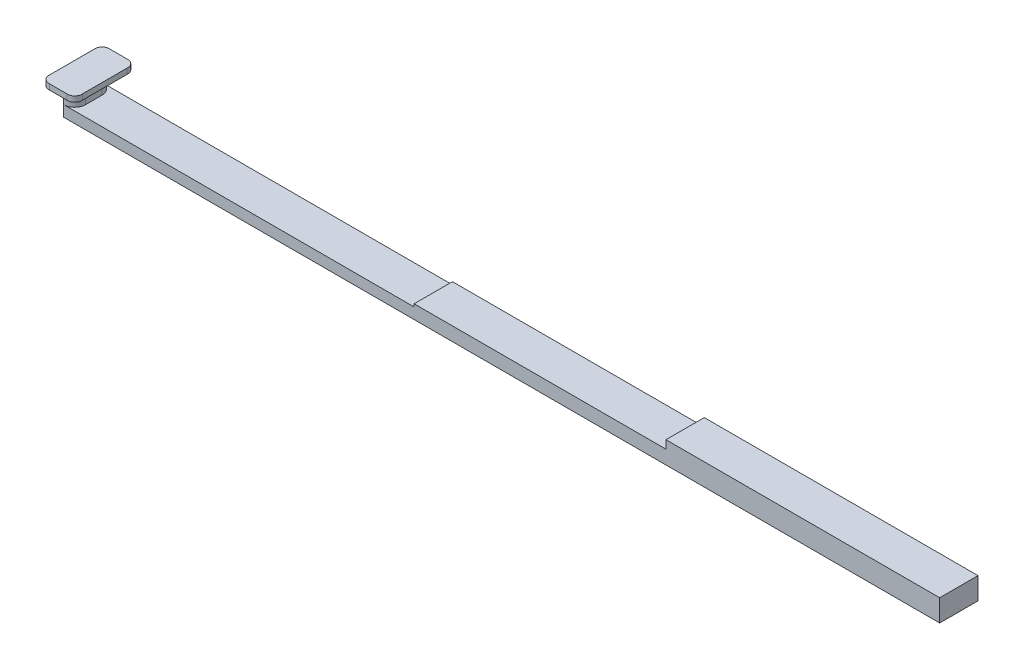
ISO-10303-21;
HEADER;
FILE_DESCRIPTION(('STEP AP214'),'2;1');
FILE_NAME('part.step','',(''),(''),'','','');
FILE_SCHEMA(('AUTOMOTIVE_DESIGN { 1 0 10303 214 1 1 1 1 }'));
ENDSEC;
DATA;
#1=APPLICATION_CONTEXT('core data for automotive mechanical design processes');
#2=APPLICATION_PROTOCOL_DEFINITION('international standard','automotive_design',2000,#1);
#3=PRODUCT_CONTEXT('',#1,'mechanical');
#4=PRODUCT('Part','Part','',(#3));
#5=PRODUCT_RELATED_PRODUCT_CATEGORY('part','',(#4));
#6=PRODUCT_DEFINITION_FORMATION('','',#4);
#7=PRODUCT_DEFINITION_CONTEXT('part definition',#1,'design');
#8=PRODUCT_DEFINITION('design','',#6,#7);
#9=PRODUCT_DEFINITION_SHAPE('','',#8);
#10=(LENGTH_UNIT() NAMED_UNIT(*) SI_UNIT(.MILLI.,.METRE.));
#11=(NAMED_UNIT(*) PLANE_ANGLE_UNIT() SI_UNIT($,.RADIAN.));
#12=(NAMED_UNIT(*) SI_UNIT($,.STERADIAN.) SOLID_ANGLE_UNIT());
#13=UNCERTAINTY_MEASURE_WITH_UNIT(LENGTH_MEASURE(1.E-05),#10,'distance_accuracy_value','');
#14=(GEOMETRIC_REPRESENTATION_CONTEXT(3) GLOBAL_UNCERTAINTY_ASSIGNED_CONTEXT((#13)) GLOBAL_UNIT_ASSIGNED_CONTEXT((#10,
#11,#12)) REPRESENTATION_CONTEXT('',''));
#15=CARTESIAN_POINT('',(0.,0.,0.));
#16=DIRECTION('',(0.,0.,1.));
#17=DIRECTION('',(1.,0.,0.));
#18=AXIS2_PLACEMENT_3D('',#15,#16,#17);
#19=CARTESIAN_POINT('',(0.,1.,0.));
#20=DIRECTION('',(0.,1.,0.));
#21=DIRECTION('',(0.,0.,1.));
#22=AXIS2_PLACEMENT_3D('',#19,#20,#21);
#23=PLANE('',#22);
#24=DIRECTION('',(-1.,0.,0.));
#25=VECTOR('',#24,1.);
#26=CARTESIAN_POINT('',(0.,1.,-3.49999999999999));
#27=LINE('',#26,#25);
#28=CARTESIAN_POINT('',(-23.,1.,-3.49999999999999));
#29=VERTEX_POINT('',#28);
#30=CARTESIAN_POINT('',(-55.,1.,-3.49999999999999));
#31=VERTEX_POINT('',#30);
#32=EDGE_CURVE('E616',#29,#31,#27,.T.);
#33=ORIENTED_EDGE('',*,*,#32,.T.);
#34=CARTESIAN_POINT('',(-55.,1.,-2.49999999999999));
#35=DIRECTION('',(0.,1.,0.));
#36=DIRECTION('',(0.,0.,1.));
#37=AXIS2_PLACEMENT_3D('',#34,#35,#36);
#38=CIRCLE('',#37,1.);
#39=CARTESIAN_POINT('',(-54.,1.,-2.49999999999999));
#40=VERTEX_POINT('',#39);
#41=EDGE_CURVE('E436',#31,#40,#38,.F.);
#42=ORIENTED_EDGE('',*,*,#41,.T.);
#43=DIRECTION('',(0.,0.,-1.));
#44=VECTOR('',#43,1.);
#45=CARTESIAN_POINT('',(-54.,1.,0.));
#46=LINE('',#45,#44);
#47=CARTESIAN_POINT('',(-54.,1.,-0.999999999999993));
#48=VERTEX_POINT('',#47);
#49=EDGE_CURVE('E464',#48,#40,#46,.T.);
#50=ORIENTED_EDGE('',*,*,#49,.F.);
#51=CARTESIAN_POINT('',(-55.,1.,-0.999999999999993));
#52=DIRECTION('',(0.,1.,0.));
#53=DIRECTION('',(0.,0.,1.));
#54=AXIS2_PLACEMENT_3D('',#51,#52,#53);
#55=CIRCLE('',#54,1.);
#56=CARTESIAN_POINT('',(-55.,1.,0.));
#57=VERTEX_POINT('',#56);
#58=EDGE_CURVE('E460',#48,#57,#55,.F.);
#59=ORIENTED_EDGE('',*,*,#58,.T.);
#60=DIRECTION('',(-1.,0.,0.));
#61=VECTOR('',#60,1.);
#62=CARTESIAN_POINT('',(0.,1.,0.));
#63=LINE('',#62,#61);
#64=CARTESIAN_POINT('',(-23.,1.,0.));
#65=VERTEX_POINT('',#64);
#66=EDGE_CURVE('E544',#65,#57,#63,.T.);
#67=ORIENTED_EDGE('',*,*,#66,.F.);
#68=DIRECTION('',(0.,0.,-1.));
#69=VECTOR('',#68,1.);
#70=CARTESIAN_POINT('',(-23.,1.,0.));
#71=LINE('',#70,#69);
#72=EDGE_CURVE('E550',#65,#29,#71,.T.);
#73=ORIENTED_EDGE('',*,*,#72,.T.);
#74=EDGE_LOOP('',(#33,#42,#50,#59,#67,#73));
#75=FACE_BOUND('',#74,.T.);
#76=ADVANCED_FACE('F35',(#75),#23,.T.);
#77=CARTESIAN_POINT('',(-55.,1.,0.));
#78=DIRECTION('',(-1.,0.,0.));
#79=DIRECTION('',(0.,0.,1.));
#80=AXIS2_PLACEMENT_3D('',#77,#78,#79);
#81=PLANE('',#80);
#82=DIRECTION('',(0.,0.,-1.));
#83=VECTOR('',#82,1.);
#84=CARTESIAN_POINT('',(-55.,0.,0.));
#85=LINE('',#84,#83);
#86=CARTESIAN_POINT('',(-55.,0.,0.));
#87=VERTEX_POINT('',#86);
#88=CARTESIAN_POINT('',(-55.,0.,-3.49999999999999));
#89=VERTEX_POINT('',#88);
#90=EDGE_CURVE('E560',#87,#89,#85,.T.);
#91=ORIENTED_EDGE('',*,*,#90,.F.);
#92=DIRECTION('',(0.,-1.,0.));
#93=VECTOR('',#92,1.);
#94=CARTESIAN_POINT('',(-55.,1.,0.));
#95=LINE('',#94,#93);
#96=EDGE_CURVE('E546',#57,#87,#95,.T.);
#97=ORIENTED_EDGE('',*,*,#96,.F.);
#98=CARTESIAN_POINT('',(-55.,1.6894686909815,0.));
#99=VERTEX_POINT('',#98);
#100=EDGE_CURVE('E60',#99,#57,#95,.T.);
#101=ORIENTED_EDGE('',*,*,#100,.F.);
#102=CARTESIAN_POINT('',(-55.,2.91421356237309,0.));
#103=DIRECTION('',(-1.,0.,0.));
#104=DIRECTION('',(0.,-0.707106781186546,-0.707106781186549));
#105=AXIS2_PLACEMENT_3D('',#102,#103,#104);
#106=ELLIPSE('',#105,1.73205080756887,1.);
#107=CARTESIAN_POINT('',(-55.,1.5,-0.707106781186538));
#108=VERTEX_POINT('',#107);
#109=EDGE_CURVE('E402',#99,#108,#106,.F.);
#110=ORIENTED_EDGE('',*,*,#109,.T.);
#111=DIRECTION('',(0.,0.,1.));
#112=VECTOR('',#111,1.);
#113=CARTESIAN_POINT('',(-55.,1.5,0.));
#114=LINE('',#113,#112);
#115=CARTESIAN_POINT('',(-55.,1.5,-2.79289321881345));
#116=VERTEX_POINT('',#115);
#117=EDGE_CURVE('E412',#116,#108,#114,.T.);
#118=ORIENTED_EDGE('',*,*,#117,.F.);
#119=CARTESIAN_POINT('',(-55.,2.91421356237309,-3.49999999999999));
#120=DIRECTION('',(-1.,0.,0.));
#121=DIRECTION('',(0.,-0.707106781186546,0.707106781186549));
#122=AXIS2_PLACEMENT_3D('',#119,#120,#121);
#123=ELLIPSE('',#122,1.73205080756887,1.);
#124=CARTESIAN_POINT('',(-55.,1.6894686909815,-3.49999999999999));
#125=VERTEX_POINT('',#124);
#126=EDGE_CURVE('E45',#116,#125,#123,.F.);
#127=ORIENTED_EDGE('',*,*,#126,.T.);
#128=DIRECTION('',(0.,-1.,0.));
#129=VECTOR('',#128,1.);
#130=CARTESIAN_POINT('',(-55.,1.,-3.49999999999999));
#131=LINE('',#130,#129);
#132=EDGE_CURVE('E52',#125,#31,#131,.T.);
#133=ORIENTED_EDGE('',*,*,#132,.T.);
#134=EDGE_CURVE('E618',#31,#89,#131,.T.);
#135=ORIENTED_EDGE('',*,*,#134,.T.);
#136=EDGE_LOOP('',(#91,#97,#101,#110,#118,#127,#133,#135));
#137=FACE_BOUND('',#136,.T.);
#138=ADVANCED_FACE('F411',(#137),#81,.T.);
#139=CARTESIAN_POINT('',(0.,1.,0.));
#140=DIRECTION('',(0.,0.,1.));
#141=DIRECTION('',(1.,0.,0.));
#142=AXIS2_PLACEMENT_3D('',#139,#140,#141);
#143=PLANE('',#142);
#144=ORIENTED_EDGE('',*,*,#66,.T.);
#145=ORIENTED_EDGE('',*,*,#96,.T.);
#146=DIRECTION('',(-1.,0.,0.));
#147=VECTOR('',#146,1.);
#148=CARTESIAN_POINT('',(0.,0.,0.));
#149=LINE('',#148,#147);
#150=CARTESIAN_POINT('',(25.,0.,0.));
#151=VERTEX_POINT('',#150);
#152=EDGE_CURVE('E620',#151,#87,#149,.T.);
#153=ORIENTED_EDGE('',*,*,#152,.F.);
#154=DIRECTION('',(0.,-1.,0.));
#155=VECTOR('',#154,1.);
#156=CARTESIAN_POINT('',(25.,2.,0.));
#157=LINE('',#156,#155);
#158=CARTESIAN_POINT('',(25.,2.,0.));
#159=VERTEX_POINT('',#158);
#160=EDGE_CURVE('E599',#159,#151,#157,.T.);
#161=ORIENTED_EDGE('',*,*,#160,.F.);
#162=DIRECTION('',(1.,0.,0.));
#163=VECTOR('',#162,1.);
#164=CARTESIAN_POINT('',(0.,2.,0.));
#165=LINE('',#164,#163);
#166=CARTESIAN_POINT('',(0.,2.,0.));
#167=VERTEX_POINT('',#166);
#168=EDGE_CURVE('E575',#167,#159,#165,.T.);
#169=ORIENTED_EDGE('',*,*,#168,.F.);
#170=DIRECTION('',(0.,-1.,0.));
#171=VECTOR('',#170,1.);
#172=CARTESIAN_POINT('',(0.,2.,0.));
#173=LINE('',#172,#171);
#174=CARTESIAN_POINT('',(0.,1.25,0.));
#175=VERTEX_POINT('',#174);
#176=EDGE_CURVE('E590',#167,#175,#173,.T.);
#177=ORIENTED_EDGE('',*,*,#176,.T.);
#178=DIRECTION('',(-1.,0.,0.));
#179=VECTOR('',#178,1.);
#180=CARTESIAN_POINT('',(0.,1.25,0.));
#181=LINE('',#180,#179);
#182=CARTESIAN_POINT('',(-23.,1.25,0.));
#183=VERTEX_POINT('',#182);
#184=EDGE_CURVE('E605',#175,#183,#181,.T.);
#185=ORIENTED_EDGE('',*,*,#184,.T.);
#186=DIRECTION('',(0.,-1.,0.));
#187=VECTOR('',#186,1.);
#188=CARTESIAN_POINT('',(-23.,1.25,0.));
#189=LINE('',#188,#187);
#190=EDGE_CURVE('E548',#183,#65,#189,.T.);
#191=ORIENTED_EDGE('',*,*,#190,.T.);
#192=EDGE_LOOP('',(#144,#145,#153,#161,#169,#177,#185,#191));
#193=FACE_BOUND('',#192,.T.);
#194=ADVANCED_FACE('F526',(#193),#143,.T.);
#195=CARTESIAN_POINT('',(0.,1.,-3.49999999999999));
#196=DIRECTION('',(0.,0.,1.));
#197=DIRECTION('',(1.,0.,0.));
#198=AXIS2_PLACEMENT_3D('',#195,#196,#197);
#199=PLANE('',#198);
#200=ORIENTED_EDGE('',*,*,#134,.F.);
#201=ORIENTED_EDGE('',*,*,#32,.F.);
#202=DIRECTION('',(0.,-1.,0.));
#203=VECTOR('',#202,1.);
#204=CARTESIAN_POINT('',(-23.,1.25,-3.49999999999999));
#205=LINE('',#204,#203);
#206=CARTESIAN_POINT('',(-23.,1.25,-3.49999999999999));
#207=VERTEX_POINT('',#206);
#208=EDGE_CURVE('E612',#207,#29,#205,.T.);
#209=ORIENTED_EDGE('',*,*,#208,.F.);
#210=DIRECTION('',(-1.,0.,0.));
#211=VECTOR('',#210,1.);
#212=CARTESIAN_POINT('',(0.,1.25,-3.5));
#213=LINE('',#212,#211);
#214=CARTESIAN_POINT('',(0.,1.25,-3.5));
#215=VERTEX_POINT('',#214);
#216=EDGE_CURVE('E610',#215,#207,#213,.T.);
#217=ORIENTED_EDGE('',*,*,#216,.F.);
#218=DIRECTION('',(0.,-1.,0.));
#219=VECTOR('',#218,1.);
#220=CARTESIAN_POINT('',(0.,2.,-3.5));
#221=LINE('',#220,#219);
#222=CARTESIAN_POINT('',(0.,2.,-3.5));
#223=VERTEX_POINT('',#222);
#224=EDGE_CURVE('E594',#223,#215,#221,.T.);
#225=ORIENTED_EDGE('',*,*,#224,.F.);
#226=DIRECTION('',(1.,0.,0.));
#227=VECTOR('',#226,1.);
#228=CARTESIAN_POINT('',(0.,2.,-3.5));
#229=LINE('',#228,#227);
#230=CARTESIAN_POINT('',(25.,2.,-3.5));
#231=VERTEX_POINT('',#230);
#232=EDGE_CURVE('E585',#223,#231,#229,.T.);
#233=ORIENTED_EDGE('',*,*,#232,.T.);
#234=DIRECTION('',(0.,-1.,0.));
#235=VECTOR('',#234,1.);
#236=CARTESIAN_POINT('',(25.,2.,-3.5));
#237=LINE('',#236,#235);
#238=CARTESIAN_POINT('',(25.,0.,-3.5));
#239=VERTEX_POINT('',#238);
#240=EDGE_CURVE('E596',#231,#239,#237,.T.);
#241=ORIENTED_EDGE('',*,*,#240,.T.);
#242=DIRECTION('',(-1.,0.,0.));
#243=VECTOR('',#242,1.);
#244=CARTESIAN_POINT('',(0.,0.,-3.49999999999999));
#245=LINE('',#244,#243);
#246=EDGE_CURVE('E551',#239,#89,#245,.T.);
#247=ORIENTED_EDGE('',*,*,#246,.T.);
#248=EDGE_LOOP('',(#200,#201,#209,#217,#225,#233,#241,#247));
#249=FACE_BOUND('',#248,.T.);
#250=ADVANCED_FACE('F534',(#249),#199,.F.);
#251=CARTESIAN_POINT('',(0.,0.,0.));
#252=DIRECTION('',(0.,1.,0.));
#253=DIRECTION('',(0.,0.,1.));
#254=AXIS2_PLACEMENT_3D('',#251,#252,#253);
#255=PLANE('',#254);
#256=ORIENTED_EDGE('',*,*,#90,.T.);
#257=ORIENTED_EDGE('',*,*,#246,.F.);
#258=DIRECTION('',(0.,0.,-1.));
#259=VECTOR('',#258,1.);
#260=CARTESIAN_POINT('',(25.,0.,0.));
#261=LINE('',#260,#259);
#262=EDGE_CURVE('E572',#151,#239,#261,.T.);
#263=ORIENTED_EDGE('',*,*,#262,.F.);
#264=ORIENTED_EDGE('',*,*,#152,.T.);
#265=EDGE_LOOP('',(#256,#257,#263,#264));
#266=FACE_BOUND('',#265,.T.);
#267=ADVANCED_FACE('F531',(#266),#255,.F.);
#268=CARTESIAN_POINT('',(-23.,1.25,0.));
#269=DIRECTION('',(-1.,0.,0.));
#270=DIRECTION('',(0.,0.,1.));
#271=AXIS2_PLACEMENT_3D('',#268,#269,#270);
#272=PLANE('',#271);
#273=ORIENTED_EDGE('',*,*,#72,.F.);
#274=ORIENTED_EDGE('',*,*,#190,.F.);
#275=DIRECTION('',(0.,0.,-1.));
#276=VECTOR('',#275,1.);
#277=CARTESIAN_POINT('',(-23.,1.25,0.));
#278=LINE('',#277,#276);
#279=EDGE_CURVE('E602',#183,#207,#278,.T.);
#280=ORIENTED_EDGE('',*,*,#279,.T.);
#281=ORIENTED_EDGE('',*,*,#208,.T.);
#282=EDGE_LOOP('',(#273,#274,#280,#281));
#283=FACE_BOUND('',#282,.T.);
#284=ADVANCED_FACE('F529',(#283),#272,.T.);
#285=CARTESIAN_POINT('',(0.,1.25,0.));
#286=DIRECTION('',(0.,1.,0.));
#287=DIRECTION('',(0.,0.,1.));
#288=AXIS2_PLACEMENT_3D('',#285,#286,#287);
#289=PLANE('',#288);
#290=ORIENTED_EDGE('',*,*,#279,.F.);
#291=ORIENTED_EDGE('',*,*,#184,.F.);
#292=DIRECTION('',(0.,0.,-1.));
#293=VECTOR('',#292,1.);
#294=CARTESIAN_POINT('',(0.,1.25,0.));
#295=LINE('',#294,#293);
#296=EDGE_CURVE('E607',#175,#215,#295,.T.);
#297=ORIENTED_EDGE('',*,*,#296,.T.);
#298=ORIENTED_EDGE('',*,*,#216,.T.);
#299=EDGE_LOOP('',(#290,#291,#297,#298));
#300=FACE_BOUND('',#299,.T.);
#301=ADVANCED_FACE('F639',(#300),#289,.T.);
#302=CARTESIAN_POINT('',(0.,2.,0.));
#303=DIRECTION('',(-1.,0.,0.));
#304=DIRECTION('',(0.,0.,1.));
#305=AXIS2_PLACEMENT_3D('',#302,#303,#304);
#306=PLANE('',#305);
#307=ORIENTED_EDGE('',*,*,#296,.F.);
#308=ORIENTED_EDGE('',*,*,#176,.F.);
#309=DIRECTION('',(0.,0.,-1.));
#310=VECTOR('',#309,1.);
#311=CARTESIAN_POINT('',(0.,2.,0.));
#312=LINE('',#311,#310);
#313=EDGE_CURVE('E588',#167,#223,#312,.T.);
#314=ORIENTED_EDGE('',*,*,#313,.T.);
#315=ORIENTED_EDGE('',*,*,#224,.T.);
#316=EDGE_LOOP('',(#307,#308,#314,#315));
#317=FACE_BOUND('',#316,.T.);
#318=ADVANCED_FACE('F635',(#317),#306,.T.);
#319=CARTESIAN_POINT('',(25.,2.,0.));
#320=DIRECTION('',(-1.,0.,0.));
#321=DIRECTION('',(0.,0.,1.));
#322=AXIS2_PLACEMENT_3D('',#319,#320,#321);
#323=PLANE('',#322);
#324=ORIENTED_EDGE('',*,*,#262,.T.);
#325=ORIENTED_EDGE('',*,*,#240,.F.);
#326=DIRECTION('',(0.,0.,-1.));
#327=VECTOR('',#326,1.);
#328=CARTESIAN_POINT('',(25.,2.,0.));
#329=LINE('',#328,#327);
#330=EDGE_CURVE('E583',#159,#231,#329,.T.);
#331=ORIENTED_EDGE('',*,*,#330,.F.);
#332=ORIENTED_EDGE('',*,*,#160,.T.);
#333=EDGE_LOOP('',(#324,#325,#331,#332));
#334=FACE_BOUND('',#333,.T.);
#335=ADVANCED_FACE('F630',(#334),#323,.F.);
#336=CARTESIAN_POINT('',(0.,2.,0.));
#337=DIRECTION('',(0.,1.,0.));
#338=DIRECTION('',(0.,0.,1.));
#339=AXIS2_PLACEMENT_3D('',#336,#337,#338);
#340=PLANE('',#339);
#341=ORIENTED_EDGE('',*,*,#168,.T.);
#342=ORIENTED_EDGE('',*,*,#330,.T.);
#343=ORIENTED_EDGE('',*,*,#232,.F.);
#344=ORIENTED_EDGE('',*,*,#313,.F.);
#345=EDGE_LOOP('',(#341,#342,#343,#344));
#346=FACE_BOUND('',#345,.T.);
#347=ADVANCED_FACE('F633',(#346),#340,.T.);
#348=CARTESIAN_POINT('',(-54.,1.5,0.));
#349=DIRECTION('',(-1.,0.,0.));
#350=DIRECTION('',(0.,0.,1.));
#351=AXIS2_PLACEMENT_3D('',#348,#349,#350);
#352=PLANE('',#351);
#353=DIRECTION('',(0.,0.,-1.));
#354=VECTOR('',#353,1.);
#355=CARTESIAN_POINT('',(-54.,1.5,0.));
#356=LINE('',#355,#354);
#357=CARTESIAN_POINT('',(-54.,1.5,-0.999999999999993));
#358=VERTEX_POINT('',#357);
#359=CARTESIAN_POINT('',(-54.,1.5,-2.49999999999999));
#360=VERTEX_POINT('',#359);
#361=EDGE_CURVE('E434',#358,#360,#356,.T.);
#362=ORIENTED_EDGE('',*,*,#361,.F.);
#363=DIRECTION('',(0.,-1.,0.));
#364=VECTOR('',#363,1.);
#365=CARTESIAN_POINT('',(-54.,1.,-0.999999999999993));
#366=LINE('',#365,#364);
#367=EDGE_CURVE('E429',#358,#48,#366,.T.);
#368=ORIENTED_EDGE('',*,*,#367,.T.);
#369=ORIENTED_EDGE('',*,*,#49,.T.);
#370=DIRECTION('',(0.,-1.,0.));
#371=VECTOR('',#370,1.);
#372=CARTESIAN_POINT('',(-54.,1.5,-2.49999999999999));
#373=LINE('',#372,#371);
#374=EDGE_CURVE('E564',#40,#360,#373,.F.);
#375=ORIENTED_EDGE('',*,*,#374,.T.);
#376=EDGE_LOOP('',(#362,#368,#369,#375));
#377=FACE_BOUND('',#376,.T.);
#378=ADVANCED_FACE('F571',(#377),#352,.F.);
#379=CARTESIAN_POINT('',(-55.,1.5,0.));
#380=DIRECTION('',(-0.707106781186546,-0.707106781186549,0.));
#381=DIRECTION('',(0.707106781186549,-0.707106781186546,0.));
#382=AXIS2_PLACEMENT_3D('',#379,#380,#381);
#383=PLANE('',#382);
#384=ORIENTED_EDGE('',*,*,#117,.T.);
#385=DIRECTION('',(-0.577350269189627,0.577350269189624,0.577350269189627));
#386=VECTOR('',#385,1.);
#387=CARTESIAN_POINT('',(-55.2357022603955,1.73570226039551,-0.471404520791022));
#388=LINE('',#387,#386);
#389=CARTESIAN_POINT('',(-56.,2.5,0.292893218813468));
#390=VERTEX_POINT('',#389);
#391=EDGE_CURVE('E387',#108,#390,#388,.T.);
#392=ORIENTED_EDGE('',*,*,#391,.T.);
#393=DIRECTION('',(0.,0.,-1.));
#394=VECTOR('',#393,1.);
#395=CARTESIAN_POINT('',(-56.,2.5,0.));
#396=LINE('',#395,#394);
#397=CARTESIAN_POINT('',(-56.,2.5,-3.79289321881345));
#398=VERTEX_POINT('',#397);
#399=EDGE_CURVE('E321',#398,#390,#396,.F.);
#400=ORIENTED_EDGE('',*,*,#399,.F.);
#401=DIRECTION('',(-0.577350269189627,0.577350269189624,-0.577350269189627));
#402=VECTOR('',#401,1.);
#403=CARTESIAN_POINT('',(-54.0690355937288,0.569035593728849,-1.86192881254229));
#404=LINE('',#403,#402);
#405=EDGE_CURVE('E441',#398,#116,#404,.F.);
#406=ORIENTED_EDGE('',*,*,#405,.T.);
#407=EDGE_LOOP('',(#384,#392,#400,#406));
#408=FACE_BOUND('',#407,.T.);
#409=ADVANCED_FACE('F260',(#408),#383,.T.);
#410=CARTESIAN_POINT('',(-55.,1.5,0.));
#411=DIRECTION('',(0.,-0.707106781186549,0.707106781186546));
#412=DIRECTION('',(0.,-0.707106781186546,-0.707106781186549));
#413=AXIS2_PLACEMENT_3D('',#410,#411,#412);
#414=PLANE('',#413);
#415=DIRECTION('',(-1.,0.,0.));
#416=VECTOR('',#415,1.);
#417=CARTESIAN_POINT('',(0.,2.5,1.00000000000001));
#418=LINE('',#417,#416);
#419=CARTESIAN_POINT('',(-55.2928932188135,2.5,1.00000000000001));
#420=VERTEX_POINT('',#419);
#421=CARTESIAN_POINT('',(-53.7071067811865,2.5,1.00000000000001));
#422=VERTEX_POINT('',#421);
#423=EDGE_CURVE('E324',#420,#422,#418,.F.);
#424=ORIENTED_EDGE('',*,*,#423,.F.);
#425=DIRECTION('',(-0.577350269189627,0.577350269189624,0.577350269189627));
#426=VECTOR('',#425,1.);
#427=CARTESIAN_POINT('',(-54.528595479209,1.73570226039552,0.235702260395523));
#428=LINE('',#427,#426);
#429=CARTESIAN_POINT('',(-54.5,1.70710678118655,0.207106781186555));
#430=VERTEX_POINT('',#429);
#431=EDGE_CURVE('E337',#420,#430,#428,.F.);
#432=ORIENTED_EDGE('',*,*,#431,.T.);
#433=DIRECTION('',(0.577350269189627,0.577350269189624,0.577350269189627));
#434=VECTOR('',#433,1.);
#435=CARTESIAN_POINT('',(-54.8047378541244,1.40236892706218,-0.0976310729378112));
#436=LINE('',#435,#434);
#437=EDGE_CURVE('E352',#430,#422,#436,.T.);
#438=ORIENTED_EDGE('',*,*,#437,.T.);
#439=EDGE_LOOP('',(#424,#432,#438));
#440=FACE_BOUND('',#439,.T.);
#441=ADVANCED_FACE('F658',(#440),#414,.T.);
#442=CARTESIAN_POINT('',(-54.,1.5,0.));
#443=DIRECTION('',(0.707106781186546,-0.707106781186549,0.));
#444=DIRECTION('',(0.707106781186549,0.707106781186546,0.));
#445=AXIS2_PLACEMENT_3D('',#442,#443,#444);
#446=PLANE('',#445);
#447=DIRECTION('',(0.,0.,1.));
#448=VECTOR('',#447,1.);
#449=CARTESIAN_POINT('',(-53.,2.5,0.));
#450=LINE('',#449,#448);
#451=CARTESIAN_POINT('',(-53.,2.5,0.292893218813468));
#452=VERTEX_POINT('',#451);
#453=CARTESIAN_POINT('',(-53.,2.5,-3.79289321881345));
#454=VERTEX_POINT('',#453);
#455=EDGE_CURVE('E293',#452,#454,#450,.F.);
#456=ORIENTED_EDGE('',*,*,#455,.F.);
#457=DIRECTION('',(0.577350269189627,0.577350269189624,0.577350269189627));
#458=VECTOR('',#457,1.);
#459=CARTESIAN_POINT('',(-53.7642977396045,1.73570226039552,-0.471404520791024));
#460=LINE('',#459,#458);
#461=CARTESIAN_POINT('',(-54.0340741737109,1.46592582628907,-0.741180954897473));
#462=VERTEX_POINT('',#461);
#463=EDGE_CURVE('E428',#452,#462,#460,.F.);
#464=ORIENTED_EDGE('',*,*,#463,.T.);
#465=CARTESIAN_POINT('',(-55.,0.500000000000003,-0.999999999999993));
#466=DIRECTION('',(0.707106781186546,-0.707106781186549,0.));
#467=DIRECTION('',(0.707106781186549,0.707106781186546,0.));
#468=AXIS2_PLACEMENT_3D('',#465,#466,#467);
#469=ELLIPSE('',#468,1.41421356237309,1.);
#470=EDGE_CURVE('E438',#462,#358,#469,.F.);
#471=ORIENTED_EDGE('',*,*,#470,.T.);
#472=ORIENTED_EDGE('',*,*,#361,.T.);
#473=CARTESIAN_POINT('',(-55.,0.500000000000003,-2.49999999999999));
#474=DIRECTION('',(0.707106781186546,-0.707106781186549,0.));
#475=DIRECTION('',(-0.707106781186549,-0.707106781186546,0.));
#476=AXIS2_PLACEMENT_3D('',#473,#474,#475);
#477=ELLIPSE('',#476,1.41421356237309,1.);
#478=CARTESIAN_POINT('',(-54.0340741737109,1.46592582628907,-2.75881904510251));
#479=VERTEX_POINT('',#478);
#480=EDGE_CURVE('E341',#360,#479,#477,.F.);
#481=ORIENTED_EDGE('',*,*,#480,.T.);
#482=DIRECTION('',(0.577350269189627,0.577350269189624,-0.577350269189627));
#483=VECTOR('',#482,1.);
#484=CARTESIAN_POINT('',(-54.9309644062712,0.569035593728851,-1.86192881254229));
#485=LINE('',#484,#483);
#486=EDGE_CURVE('E423',#479,#454,#485,.T.);
#487=ORIENTED_EDGE('',*,*,#486,.T.);
#488=EDGE_LOOP('',(#456,#464,#471,#472,#481,#487));
#489=FACE_BOUND('',#488,.T.);
#490=ADVANCED_FACE('F432',(#489),#446,.T.);
#491=CARTESIAN_POINT('',(-55.,1.5,-3.49999999999999));
#492=DIRECTION('',(0.,-0.707106781186549,-0.707106781186546));
#493=DIRECTION('',(0.,0.707106781186546,-0.707106781186549));
#494=AXIS2_PLACEMENT_3D('',#491,#492,#493);
#495=PLANE('',#494);
#496=DIRECTION('',(0.577350269189627,0.577350269189624,-0.577350269189627));
#497=VECTOR('',#496,1.);
#498=CARTESIAN_POINT('',(-54.8047378541244,1.40236892706218,-3.40236892706218));
#499=LINE('',#498,#497);
#500=CARTESIAN_POINT('',(-53.7071067811865,2.5,-4.5));
#501=VERTEX_POINT('',#500);
#502=CARTESIAN_POINT('',(-54.5,1.70710678118654,-3.70710678118654));
#503=VERTEX_POINT('',#502);
#504=EDGE_CURVE('E458',#501,#503,#499,.F.);
#505=ORIENTED_EDGE('',*,*,#504,.T.);
#506=DIRECTION('',(-0.577350269189627,0.577350269189624,-0.577350269189627));
#507=VECTOR('',#506,1.);
#508=CARTESIAN_POINT('',(-54.528595479209,1.73570226039552,-3.73570226039551));
#509=LINE('',#508,#507);
#510=CARTESIAN_POINT('',(-55.2928932188135,2.5,-4.5));
#511=VERTEX_POINT('',#510);
#512=EDGE_CURVE('E403',#503,#511,#509,.T.);
#513=ORIENTED_EDGE('',*,*,#512,.T.);
#514=DIRECTION('',(1.,0.,0.));
#515=VECTOR('',#514,1.);
#516=CARTESIAN_POINT('',(0.,2.5,-4.5));
#517=LINE('',#516,#515);
#518=EDGE_CURVE('E309',#501,#511,#517,.F.);
#519=ORIENTED_EDGE('',*,*,#518,.F.);
#520=EDGE_LOOP('',(#505,#513,#519));
#521=FACE_BOUND('',#520,.T.);
#522=ADVANCED_FACE('F365',(#521),#495,.T.);
#523=CARTESIAN_POINT('',(-54.471404520791,2.44280904158206,-0.471404520791024));
#524=DIRECTION('',(-0.577350269189627,-0.577350269189624,-0.577350269189627));
#525=DIRECTION('',(-0.707106781186547,0.,0.707106781186547));
#526=AXIS2_PLACEMENT_3D('',#523,#524,#525);
#527=CYLINDRICAL_SURFACE('',#526,1.);
#528=ORIENTED_EDGE('',*,*,#437,.F.);
#529=CARTESIAN_POINT('',(-54.5,2.41421356237309,-0.499999999999994));
#530=DIRECTION('',(-1.,0.,0.));
#531=DIRECTION('',(0.,-0.707106781186546,-0.707106781186549));
#532=AXIS2_PLACEMENT_3D('',#529,#530,#531);
#533=ELLIPSE('',#532,1.73205080756887,1.);
#534=CARTESIAN_POINT('',(-54.5,1.41421356237309,-0.133974596215555));
#535=VERTEX_POINT('',#534);
#536=EDGE_CURVE('E340',#430,#535,#533,.F.);
#537=ORIENTED_EDGE('',*,*,#536,.T.);
#538=CARTESIAN_POINT('',(-55.,1.9142135623731,-0.999999999999994));
#539=DIRECTION('',(0.325057583671869,0.888073833977115,0.325057583671869));
#540=DIRECTION('',(-0.627963030199554,0.459700843380984,-0.627963030199554));
#541=AXIS2_PLACEMENT_3D('',#538,#539,#540);
#542=ELLIPSE('',#541,1.12603250061049,1.);
#543=EDGE_CURVE('E222',#462,#535,#542,.F.);
#544=ORIENTED_EDGE('',*,*,#543,.F.);
#545=ORIENTED_EDGE('',*,*,#463,.F.);
#546=CARTESIAN_POINT('',(-53.6524168464264,2.5,0.347583153573566));
#547=DIRECTION('',(0.,1.,0.));
#548=DIRECTION('',(-0.0835336965489974,0.,0.996504953093992));
#549=AXIS2_PLACEMENT_3D('',#546,#547,#548);
#550=CIRCLE('',#549,0.654705071360446);
#551=EDGE_CURVE('E237',#422,#452,#550,.T.);
#552=ORIENTED_EDGE('',*,*,#551,.F.);
#553=EDGE_LOOP('',(#528,#537,#544,#545,#552));
#554=FACE_BOUND('',#553,.T.);
#555=ADVANCED_FACE('F354',(#554),#527,.T.);
#556=CARTESIAN_POINT('',(-55.,1.5,-0.999999999999993));
#557=DIRECTION('',(0.,1.,0.));
#558=DIRECTION('',(0.,0.,1.));
#559=AXIS2_PLACEMENT_3D('',#556,#557,#558);
#560=CYLINDRICAL_SURFACE('',#559,1.);
#561=ORIENTED_EDGE('',*,*,#543,.T.);
#562=CARTESIAN_POINT('',(-54.5,1.41421356237309,-0.133974596215555));
#563=CARTESIAN_POINT('',(-54.5266151248421,1.43261761021214,-0.118595916916454));
#564=CARTESIAN_POINT('',(-54.5541879398347,1.45056681233239,-0.104325525532398));
#565=CARTESIAN_POINT('',(-54.6109652356036,1.48568369920809,-0.0782502599266834));
#566=CARTESIAN_POINT('',(-54.6401703008595,1.50285109996909,-0.0664462761440831));
#567=CARTESIAN_POINT('',(-54.6993274998772,1.53619186387758,-0.0457674074255725));
#568=CARTESIAN_POINT('',(-54.7292540347567,1.55237807005701,-0.036839990700825));
#569=CARTESIAN_POINT('',(-54.7900149808422,1.5843056764526,-0.0217950970654351));
#570=CARTESIAN_POINT('',(-54.820848851545,1.60004733095882,-0.0156759819069786));
#571=CARTESIAN_POINT('',(-54.8763345750286,1.62796609663996,-0.00736973846450256));
#572=CARTESIAN_POINT('',(-54.9008853476069,1.64017969867852,-0.00461919069330402));
#573=CARTESIAN_POINT('',(-54.9503027446918,1.66472413076465,-0.000924720046985781));
#574=CARTESIAN_POINT('',(-54.9751703421301,1.67705513537143,5.02658163584056E-06));
#575=CARTESIAN_POINT('',(-55.,1.6894686909815,0.));
#576=B_SPLINE_CURVE_WITH_KNOTS('',3,(#562,#563,#564,#565,#566,#567,#568,#569,#570,#571,#572,
#573,#574,#575),.UNSPECIFIED.,.F.,.F.,(4,2,2,2,2,2,4),(0.,0.107452928556525,0.214944583717785,
0.320344381857321,0.425682615682584,0.508300136825395,0.591558377056568),.UNSPECIFIED.);
#577=EDGE_CURVE('E397',#535,#99,#576,.T.);
#578=ORIENTED_EDGE('',*,*,#577,.T.);
#579=ORIENTED_EDGE('',*,*,#100,.T.);
#580=ORIENTED_EDGE('',*,*,#58,.F.);
#581=ORIENTED_EDGE('',*,*,#367,.F.);
#582=ORIENTED_EDGE('',*,*,#470,.F.);
#583=EDGE_LOOP('',(#561,#578,#579,#580,#581,#582));
#584=FACE_BOUND('',#583,.T.);
#585=ADVANCED_FACE('F364',(#584),#560,.T.);
#586=CARTESIAN_POINT('',(-54.8047378541244,2.10947570824873,-2.69526214587563));
#587=DIRECTION('',(-0.577350269189627,-0.577350269189624,0.577350269189627));
#588=DIRECTION('',(0.707106781186547,0.,0.707106781186547));
#589=AXIS2_PLACEMENT_3D('',#586,#587,#588);
#590=CYLINDRICAL_SURFACE('',#589,1.);
#591=CARTESIAN_POINT('',(-55.,1.91421356237309,-2.49999999999999));
#592=DIRECTION('',(-0.325057583671869,-0.888073833977115,0.325057583671869));
#593=DIRECTION('',(0.627963030199554,-0.459700843380984,-0.627963030199554));
#594=AXIS2_PLACEMENT_3D('',#591,#592,#593);
#595=ELLIPSE('',#594,1.12603250061049,1.);
#596=CARTESIAN_POINT('',(-54.5,1.41421356237309,-3.36602540378443));
#597=VERTEX_POINT('',#596);
#598=EDGE_CURVE('E220',#597,#479,#595,.T.);
#599=ORIENTED_EDGE('',*,*,#598,.F.);
#600=CARTESIAN_POINT('',(-54.5,2.41421356237309,-2.99999999999999));
#601=DIRECTION('',(-1.,0.,0.));
#602=DIRECTION('',(0.,-0.707106781186546,0.707106781186549));
#603=AXIS2_PLACEMENT_3D('',#600,#601,#602);
#604=ELLIPSE('',#603,1.73205080756887,1.);
#605=EDGE_CURVE('E404',#597,#503,#604,.F.);
#606=ORIENTED_EDGE('',*,*,#605,.T.);
#607=ORIENTED_EDGE('',*,*,#504,.F.);
#608=CARTESIAN_POINT('',(-53.6524168464264,2.5,-3.84758315357355));
#609=DIRECTION('',(0.,1.,0.));
#610=DIRECTION('',(0.996504953093994,0.,0.0835336965489772));
#611=AXIS2_PLACEMENT_3D('',#608,#609,#610);
#612=CIRCLE('',#611,0.654705071360444);
#613=EDGE_CURVE('E425',#454,#501,#612,.T.);
#614=ORIENTED_EDGE('',*,*,#613,.F.);
#615=ORIENTED_EDGE('',*,*,#486,.F.);
#616=EDGE_LOOP('',(#599,#606,#607,#614,#615));
#617=FACE_BOUND('',#616,.T.);
#618=ADVANCED_FACE('F373',(#617),#590,.T.);
#619=CARTESIAN_POINT('',(-55.,1.,-2.49999999999999));
#620=DIRECTION('',(0.,-1.,0.));
#621=DIRECTION('',(0.,0.,-1.));
#622=AXIS2_PLACEMENT_3D('',#619,#620,#621);
#623=CYLINDRICAL_SURFACE('',#622,1.);
#624=ORIENTED_EDGE('',*,*,#480,.F.);
#625=ORIENTED_EDGE('',*,*,#374,.F.);
#626=ORIENTED_EDGE('',*,*,#41,.F.);
#627=ORIENTED_EDGE('',*,*,#132,.F.);
#628=CARTESIAN_POINT('',(-55.,1.6894686909815,-3.49999999999999));
#629=CARTESIAN_POINT('',(-54.9679883482582,1.67346844035996,-3.50001528039358));
#630=CARTESIAN_POINT('',(-54.9359131548531,1.65759911701809,-3.49846361034555));
#631=CARTESIAN_POINT('',(-54.872062821026,1.62582663949543,-3.49229673916484));
#632=CARTESIAN_POINT('',(-54.8402877753644,1.60992347645281,-3.48768060130469));
#633=CARTESIAN_POINT('',(-54.7780951395444,1.5781091845052,-3.47557401581599));
#634=CARTESIAN_POINT('',(-54.7476631698055,1.56220421468082,-3.46814116099617));
#635=CARTESIAN_POINT('',(-54.6879045739335,1.52986717549067,-3.45056054323611));
#636=CARTESIAN_POINT('',(-54.6585773250501,1.51343541305916,-3.44041433680132));
#637=CARTESIAN_POINT('',(-54.6074188719602,1.48343455146864,-3.42003750703664));
#638=CARTESIAN_POINT('',(-54.5853183638167,1.46999854983967,-3.4102823644588));
#639=CARTESIAN_POINT('',(-54.5419502130469,1.44253835799589,-3.3892564429768));
#640=CARTESIAN_POINT('',(-54.5206903594406,1.42851041408971,-3.37797449580068));
#641=CARTESIAN_POINT('',(-54.5,1.41421356237309,-3.36602540378443));
#642=B_SPLINE_CURVE_WITH_KNOTS('',3,(#628,#629,#630,#631,#632,#633,#634,#635,#636,#637,#638,
#639,#640,#641),.UNSPECIFIED.,.F.,.F.,(4,2,2,2,2,2,4),(0.,0.107327039254094,0.214686900686109,
0.319960680451734,0.425174199312487,0.508044746613777,0.591558027095634),.UNSPECIFIED.);
#643=EDGE_CURVE('E11',#125,#597,#642,.T.);
#644=ORIENTED_EDGE('',*,*,#643,.T.);
#645=ORIENTED_EDGE('',*,*,#598,.T.);
#646=EDGE_LOOP('',(#624,#625,#626,#627,#644,#645));
#647=FACE_BOUND('',#646,.T.);
#648=ADVANCED_FACE('F368',(#647),#623,.T.);
#649=CARTESIAN_POINT('',(-54.528595479209,2.44280904158206,-0.471404520791024));
#650=DIRECTION('',(0.577350269189627,-0.577350269189624,-0.577350269189627));
#651=DIRECTION('',(-0.707106781186547,0.,-0.707106781186547));
#652=AXIS2_PLACEMENT_3D('',#649,#650,#651);
#653=CYLINDRICAL_SURFACE('',#652,1.);
#654=CARTESIAN_POINT('',(-55.3475831535736,2.5,0.347583153573568));
#655=DIRECTION('',(0.,1.,0.));
#656=DIRECTION('',(-0.996504953093994,0.,-0.0835336965489774));
#657=AXIS2_PLACEMENT_3D('',#654,#655,#656);
#658=CIRCLE('',#657,0.654705071360444);
#659=EDGE_CURVE('E218',#390,#420,#658,.T.);
#660=ORIENTED_EDGE('',*,*,#659,.F.);
#661=ORIENTED_EDGE('',*,*,#391,.F.);
#662=ORIENTED_EDGE('',*,*,#109,.F.);
#663=ORIENTED_EDGE('',*,*,#577,.F.);
#664=ORIENTED_EDGE('',*,*,#536,.F.);
#665=ORIENTED_EDGE('',*,*,#431,.F.);
#666=EDGE_LOOP('',(#660,#661,#662,#663,#664,#665));
#667=FACE_BOUND('',#666,.T.);
#668=ADVANCED_FACE('F372',(#667),#653,.T.);
#669=CARTESIAN_POINT('',(-53.3619288125423,1.2761423749154,-1.86192881254229));
#670=DIRECTION('',(0.577350269189627,-0.577350269189624,0.577350269189627));
#671=DIRECTION('',(0.707106781186547,0.,-0.707106781186547));
#672=AXIS2_PLACEMENT_3D('',#669,#670,#671);
#673=CYLINDRICAL_SURFACE('',#672,1.);
#674=CARTESIAN_POINT('',(-55.3475831535736,2.5,-3.84758315357355));
#675=DIRECTION('',(0.,1.,0.));
#676=DIRECTION('',(0.0835336965489974,0.,-0.996504953093992));
#677=AXIS2_PLACEMENT_3D('',#674,#675,#676);
#678=CIRCLE('',#677,0.654705071360446);
#679=EDGE_CURVE('E315',#511,#398,#678,.T.);
#680=ORIENTED_EDGE('',*,*,#679,.F.);
#681=ORIENTED_EDGE('',*,*,#512,.F.);
#682=ORIENTED_EDGE('',*,*,#605,.F.);
#683=ORIENTED_EDGE('',*,*,#643,.F.);
#684=ORIENTED_EDGE('',*,*,#126,.F.);
#685=ORIENTED_EDGE('',*,*,#405,.F.);
#686=EDGE_LOOP('',(#680,#681,#682,#683,#684,#685));
#687=FACE_BOUND('',#686,.T.);
#688=ADVANCED_FACE('F37',(#687),#673,.T.);
#689=CARTESIAN_POINT('',(-55.3475831535736,3.,0.347583153573568));
#690=DIRECTION('',(0.,-1.,0.));
#691=DIRECTION('',(0.,0.,-1.));
#692=AXIS2_PLACEMENT_3D('',#689,#690,#691);
#693=CYLINDRICAL_SURFACE('',#692,0.654705071360446);
#694=ORIENTED_EDGE('',*,*,#659,.T.);
#695=DIRECTION('',(0.,-1.,0.));
#696=VECTOR('',#695,1.);
#697=CARTESIAN_POINT('',(-55.2928932188135,3.,1.00000000000001));
#698=LINE('',#697,#696);
#699=CARTESIAN_POINT('',(-55.2928932188135,3.,1.00000000000001));
#700=VERTEX_POINT('',#699);
#701=EDGE_CURVE('E199',#700,#420,#698,.T.);
#702=ORIENTED_EDGE('',*,*,#701,.F.);
#703=CARTESIAN_POINT('',(-55.3475831535736,3.,0.347583153573568));
#704=DIRECTION('',(0.,1.,0.));
#705=DIRECTION('',(0.,0.,-1.));
#706=AXIS2_PLACEMENT_3D('',#703,#704,#705);
#707=CIRCLE('',#706,0.654705071360446);
#708=CARTESIAN_POINT('',(-56.,3.,0.292893218813468));
#709=VERTEX_POINT('',#708);
#710=EDGE_CURVE('E206',#709,#700,#707,.T.);
#711=ORIENTED_EDGE('',*,*,#710,.F.);
#712=DIRECTION('',(0.,-1.,0.));
#713=VECTOR('',#712,1.);
#714=CARTESIAN_POINT('',(-56.,3.,0.292893218813468));
#715=LINE('',#714,#713);
#716=EDGE_CURVE('E266',#709,#390,#715,.T.);
#717=ORIENTED_EDGE('',*,*,#716,.T.);
#718=EDGE_LOOP('',(#694,#702,#711,#717));
#719=FACE_BOUND('',#718,.T.);
#720=ADVANCED_FACE('F216',(#719),#693,.T.);
#721=CARTESIAN_POINT('',(-55.2928932188135,3.,1.00000000000001));
#722=DIRECTION('',(0.,0.,-1.));
#723=DIRECTION('',(-1.,0.,0.));
#724=AXIS2_PLACEMENT_3D('',#721,#722,#723);
#725=PLANE('',#724);
#726=ORIENTED_EDGE('',*,*,#423,.T.);
#727=DIRECTION('',(0.,-1.,0.));
#728=VECTOR('',#727,1.);
#729=CARTESIAN_POINT('',(-53.7071067811865,3.,1.00000000000001));
#730=LINE('',#729,#728);
#731=CARTESIAN_POINT('',(-53.7071067811865,3.,1.00000000000001));
#732=VERTEX_POINT('',#731);
#733=EDGE_CURVE('E202',#732,#422,#730,.T.);
#734=ORIENTED_EDGE('',*,*,#733,.F.);
#735=DIRECTION('',(1.,0.,0.));
#736=VECTOR('',#735,1.);
#737=CARTESIAN_POINT('',(-55.2928932188135,3.,1.00000000000001));
#738=LINE('',#737,#736);
#739=EDGE_CURVE('E194',#700,#732,#738,.T.);
#740=ORIENTED_EDGE('',*,*,#739,.F.);
#741=ORIENTED_EDGE('',*,*,#701,.T.);
#742=EDGE_LOOP('',(#726,#734,#740,#741));
#743=FACE_BOUND('',#742,.T.);
#744=ADVANCED_FACE('F197',(#743),#725,.F.);
#745=CARTESIAN_POINT('',(-53.6524168464264,3.,0.347583153573566));
#746=DIRECTION('',(0.,-1.,0.));
#747=DIRECTION('',(0.,0.,-1.));
#748=AXIS2_PLACEMENT_3D('',#745,#746,#747);
#749=CYLINDRICAL_SURFACE('',#748,0.654705071360446);
#750=ORIENTED_EDGE('',*,*,#551,.T.);
#751=DIRECTION('',(0.,-1.,0.));
#752=VECTOR('',#751,1.);
#753=CARTESIAN_POINT('',(-53.,3.,0.292893218813466));
#754=LINE('',#753,#752);
#755=CARTESIAN_POINT('',(-53.,3.,0.292893218813466));
#756=VERTEX_POINT('',#755);
#757=EDGE_CURVE('E224',#756,#452,#754,.T.);
#758=ORIENTED_EDGE('',*,*,#757,.F.);
#759=CARTESIAN_POINT('',(-53.6524168464264,3.,0.347583153573566));
#760=DIRECTION('',(0.,1.,0.));
#761=DIRECTION('',(0.,0.,1.));
#762=AXIS2_PLACEMENT_3D('',#759,#760,#761);
#763=CIRCLE('',#762,0.654705071360446);
#764=EDGE_CURVE('E205',#732,#756,#763,.T.);
#765=ORIENTED_EDGE('',*,*,#764,.F.);
#766=ORIENTED_EDGE('',*,*,#733,.T.);
#767=EDGE_LOOP('',(#750,#758,#765,#766));
#768=FACE_BOUND('',#767,.T.);
#769=ADVANCED_FACE('F243',(#768),#749,.T.);
#770=CARTESIAN_POINT('',(-53.,3.,0.292893218813466));
#771=DIRECTION('',(-1.,0.,0.));
#772=DIRECTION('',(0.,0.,1.));
#773=AXIS2_PLACEMENT_3D('',#770,#771,#772);
#774=PLANE('',#773);
#775=ORIENTED_EDGE('',*,*,#455,.T.);
#776=DIRECTION('',(0.,-1.,0.));
#777=VECTOR('',#776,1.);
#778=CARTESIAN_POINT('',(-53.,3.,-3.79289321881345));
#779=LINE('',#778,#777);
#780=CARTESIAN_POINT('',(-53.,3.,-3.79289321881345));
#781=VERTEX_POINT('',#780);
#782=EDGE_CURVE('E289',#781,#454,#779,.T.);
#783=ORIENTED_EDGE('',*,*,#782,.F.);
#784=DIRECTION('',(0.,0.,-1.));
#785=VECTOR('',#784,1.);
#786=CARTESIAN_POINT('',(-53.,3.,0.292893218813466));
#787=LINE('',#786,#785);
#788=EDGE_CURVE('E283',#756,#781,#787,.T.);
#789=ORIENTED_EDGE('',*,*,#788,.F.);
#790=ORIENTED_EDGE('',*,*,#757,.T.);
#791=EDGE_LOOP('',(#775,#783,#789,#790));
#792=FACE_BOUND('',#791,.T.);
#793=ADVANCED_FACE('F253',(#792),#774,.F.);
#794=CARTESIAN_POINT('',(-53.6524168464264,3.,-3.84758315357355));
#795=DIRECTION('',(0.,-1.,0.));
#796=DIRECTION('',(0.,0.,-1.));
#797=AXIS2_PLACEMENT_3D('',#794,#795,#796);
#798=CYLINDRICAL_SURFACE('',#797,0.654705071360446);
#799=ORIENTED_EDGE('',*,*,#613,.T.);
#800=DIRECTION('',(0.,-1.,0.));
#801=VECTOR('',#800,1.);
#802=CARTESIAN_POINT('',(-53.7071067811865,3.,-4.5));
#803=LINE('',#802,#801);
#804=CARTESIAN_POINT('',(-53.7071067811865,3.,-4.5));
#805=VERTEX_POINT('',#804);
#806=EDGE_CURVE('E296',#805,#501,#803,.T.);
#807=ORIENTED_EDGE('',*,*,#806,.F.);
#808=CARTESIAN_POINT('',(-53.6524168464264,3.,-3.84758315357355));
#809=DIRECTION('',(0.,1.,0.));
#810=DIRECTION('',(0.,0.,-1.));
#811=AXIS2_PLACEMENT_3D('',#808,#809,#810);
#812=CIRCLE('',#811,0.654705071360446);
#813=EDGE_CURVE('E281',#781,#805,#812,.T.);
#814=ORIENTED_EDGE('',*,*,#813,.F.);
#815=ORIENTED_EDGE('',*,*,#782,.T.);
#816=EDGE_LOOP('',(#799,#807,#814,#815));
#817=FACE_BOUND('',#816,.T.);
#818=ADVANCED_FACE('F299',(#817),#798,.T.);
#819=CARTESIAN_POINT('',(-55.2928932188135,3.,-4.5));
#820=DIRECTION('',(0.,0.,1.));
#821=DIRECTION('',(1.,0.,0.));
#822=AXIS2_PLACEMENT_3D('',#819,#820,#821);
#823=PLANE('',#822);
#824=ORIENTED_EDGE('',*,*,#518,.T.);
#825=DIRECTION('',(0.,-1.,0.));
#826=VECTOR('',#825,1.);
#827=CARTESIAN_POINT('',(-55.2928932188135,3.,-4.49999999999999));
#828=LINE('',#827,#826);
#829=CARTESIAN_POINT('',(-55.2928932188135,3.,-4.49999999999999));
#830=VERTEX_POINT('',#829);
#831=EDGE_CURVE('E274',#830,#511,#828,.T.);
#832=ORIENTED_EDGE('',*,*,#831,.F.);
#833=DIRECTION('',(-1.,0.,0.));
#834=VECTOR('',#833,1.);
#835=CARTESIAN_POINT('',(-55.2928932188135,3.,-4.5));
#836=LINE('',#835,#834);
#837=EDGE_CURVE('E277',#805,#830,#836,.T.);
#838=ORIENTED_EDGE('',*,*,#837,.F.);
#839=ORIENTED_EDGE('',*,*,#806,.T.);
#840=EDGE_LOOP('',(#824,#832,#838,#839));
#841=FACE_BOUND('',#840,.T.);
#842=ADVANCED_FACE('F308',(#841),#823,.F.);
#843=CARTESIAN_POINT('',(-55.3475831535736,3.,-3.84758315357355));
#844=DIRECTION('',(0.,-1.,0.));
#845=DIRECTION('',(0.,0.,-1.));
#846=AXIS2_PLACEMENT_3D('',#843,#844,#845);
#847=CYLINDRICAL_SURFACE('',#846,0.654705071360446);
#848=ORIENTED_EDGE('',*,*,#679,.T.);
#849=DIRECTION('',(0.,-1.,0.));
#850=VECTOR('',#849,1.);
#851=CARTESIAN_POINT('',(-56.,3.,-3.79289321881345));
#852=LINE('',#851,#850);
#853=CARTESIAN_POINT('',(-56.,3.,-3.79289321881345));
#854=VERTEX_POINT('',#853);
#855=EDGE_CURVE('E272',#854,#398,#852,.T.);
#856=ORIENTED_EDGE('',*,*,#855,.F.);
#857=CARTESIAN_POINT('',(-55.3475831535736,3.,-3.84758315357355));
#858=DIRECTION('',(0.,1.,0.));
#859=DIRECTION('',(0.,0.,1.));
#860=AXIS2_PLACEMENT_3D('',#857,#858,#859);
#861=CIRCLE('',#860,0.654705071360446);
#862=EDGE_CURVE('E276',#830,#854,#861,.T.);
#863=ORIENTED_EDGE('',*,*,#862,.F.);
#864=ORIENTED_EDGE('',*,*,#831,.T.);
#865=EDGE_LOOP('',(#848,#856,#863,#864));
#866=FACE_BOUND('',#865,.T.);
#867=ADVANCED_FACE('F313',(#866),#847,.T.);
#868=CARTESIAN_POINT('',(-56.,3.,0.292893218813468));
#869=DIRECTION('',(1.,0.,0.));
#870=DIRECTION('',(0.,0.,-1.));
#871=AXIS2_PLACEMENT_3D('',#868,#869,#870);
#872=PLANE('',#871);
#873=ORIENTED_EDGE('',*,*,#399,.T.);
#874=ORIENTED_EDGE('',*,*,#716,.F.);
#875=DIRECTION('',(0.,0.,1.));
#876=VECTOR('',#875,1.);
#877=CARTESIAN_POINT('',(-56.,3.,0.292893218813468));
#878=LINE('',#877,#876);
#879=EDGE_CURVE('E211',#854,#709,#878,.T.);
#880=ORIENTED_EDGE('',*,*,#879,.F.);
#881=ORIENTED_EDGE('',*,*,#855,.T.);
#882=EDGE_LOOP('',(#873,#874,#880,#881));
#883=FACE_BOUND('',#882,.T.);
#884=ADVANCED_FACE('F319',(#883),#872,.F.);
#885=CARTESIAN_POINT('',(-55.3475831535736,3.,0.347583153573568));
#886=DIRECTION('',(0.,-1.,0.));
#887=DIRECTION('',(0.,0.,-1.));
#888=AXIS2_PLACEMENT_3D('',#885,#886,#887);
#889=PLANE('',#888);
#890=ORIENTED_EDGE('',*,*,#710,.T.);
#891=ORIENTED_EDGE('',*,*,#739,.T.);
#892=ORIENTED_EDGE('',*,*,#764,.T.);
#893=ORIENTED_EDGE('',*,*,#788,.T.);
#894=ORIENTED_EDGE('',*,*,#813,.T.);
#895=ORIENTED_EDGE('',*,*,#837,.T.);
#896=ORIENTED_EDGE('',*,*,#862,.T.);
#897=ORIENTED_EDGE('',*,*,#879,.T.);
#898=EDGE_LOOP('',(#890,#891,#892,#893,#894,#895,#896,#897));
#899=FACE_BOUND('',#898,.T.);
#900=ADVANCED_FACE('F209',(#899),#889,.F.);
#901=CLOSED_SHELL('',(#76,#138,#194,#250,#267,#284,#301,#318,#335,#347,#378,#409,#441,#490,#522,
#555,#585,#618,#648,#668,#688,#720,#744,#769,#793,#818,#842,#867,#884,#900));
#902=MANIFOLD_SOLID_BREP('B2',#901);
#903=ADVANCED_BREP_SHAPE_REPRESENTATION('',(#18,#902),#14);
#904=SHAPE_DEFINITION_REPRESENTATION(#9,#903);
ENDSEC;
END-ISO-10303-21;
